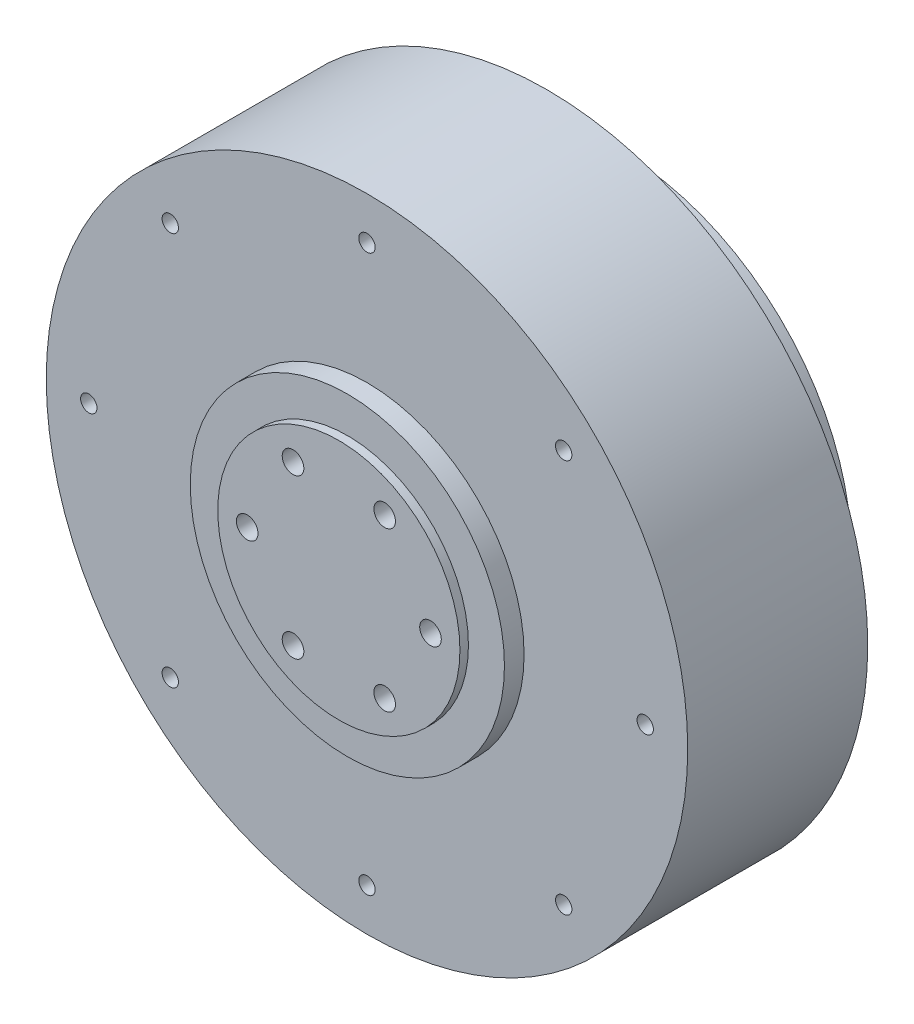
ISO-10303-21;
HEADER;
FILE_DESCRIPTION(('STEP AP214'),'2;1');
FILE_NAME('part.step','',(''),(''),'','','');
FILE_SCHEMA(('AUTOMOTIVE_DESIGN { 1 0 10303 214 1 1 1 1 }'));
ENDSEC;
DATA;
#1=APPLICATION_CONTEXT('core data for automotive mechanical design processes');
#2=APPLICATION_PROTOCOL_DEFINITION('international standard','automotive_design',2000,#1);
#3=PRODUCT_CONTEXT('',#1,'mechanical');
#4=PRODUCT('Part','Part','',(#3));
#5=PRODUCT_RELATED_PRODUCT_CATEGORY('part','',(#4));
#6=PRODUCT_DEFINITION_FORMATION('','',#4);
#7=PRODUCT_DEFINITION_CONTEXT('part definition',#1,'design');
#8=PRODUCT_DEFINITION('design','',#6,#7);
#9=PRODUCT_DEFINITION_SHAPE('','',#8);
#10=(LENGTH_UNIT() NAMED_UNIT(*) SI_UNIT(.MILLI.,.METRE.));
#11=(NAMED_UNIT(*) PLANE_ANGLE_UNIT() SI_UNIT($,.RADIAN.));
#12=(NAMED_UNIT(*) SI_UNIT($,.STERADIAN.) SOLID_ANGLE_UNIT());
#13=UNCERTAINTY_MEASURE_WITH_UNIT(LENGTH_MEASURE(1.E-05),#10,'distance_accuracy_value','');
#14=(GEOMETRIC_REPRESENTATION_CONTEXT(3) GLOBAL_UNCERTAINTY_ASSIGNED_CONTEXT((#13)) GLOBAL_UNIT_ASSIGNED_CONTEXT((#10,
#11,#12)) REPRESENTATION_CONTEXT('',''));
#15=CARTESIAN_POINT('',(0.,0.,0.));
#16=DIRECTION('',(0.,0.,1.));
#17=DIRECTION('',(1.,0.,0.));
#18=AXIS2_PLACEMENT_3D('',#15,#16,#17);
#19=CARTESIAN_POINT('',(0.,0.,0.));
#20=DIRECTION('',(0.,0.,-1.));
#21=DIRECTION('',(-1.,0.,0.));
#22=AXIS2_PLACEMENT_3D('',#19,#20,#21);
#23=PLANE('',#22);
#24=CARTESIAN_POINT('',(-14.,0.,0.));
#25=DIRECTION('',(0.,0.,1.));
#26=DIRECTION('',(1.,0.,0.));
#27=AXIS2_PLACEMENT_3D('',#24,#25,#26);
#28=CIRCLE('',#27,1.64999999999999);
#29=CARTESIAN_POINT('',(-12.35,0.,0.));
#30=VERTEX_POINT('',#29);
#31=EDGE_CURVE('E221',#30,#30,#28,.T.);
#32=ORIENTED_EDGE('',*,*,#31,.F.);
#33=EDGE_LOOP('',(#32));
#34=FACE_BOUND('',#33,.T.);
#35=CARTESIAN_POINT('',(-6.99999999999997,12.1243556529822,0.));
#36=DIRECTION('',(0.,0.,1.));
#37=DIRECTION('',(1.,0.,0.));
#38=AXIS2_PLACEMENT_3D('',#35,#36,#37);
#39=CIRCLE('',#38,1.64999999999999);
#40=CARTESIAN_POINT('',(-5.34999999999998,12.1243556529822,0.));
#41=VERTEX_POINT('',#40);
#42=EDGE_CURVE('E227',#41,#41,#39,.T.);
#43=ORIENTED_EDGE('',*,*,#42,.F.);
#44=EDGE_LOOP('',(#43));
#45=FACE_BOUND('',#44,.T.);
#46=CARTESIAN_POINT('',(14.,0.,0.));
#47=DIRECTION('',(0.,0.,1.));
#48=DIRECTION('',(1.,0.,0.));
#49=AXIS2_PLACEMENT_3D('',#46,#47,#48);
#50=CIRCLE('',#49,1.64999999999999);
#51=CARTESIAN_POINT('',(15.65,0.,0.));
#52=VERTEX_POINT('',#51);
#53=EDGE_CURVE('E239',#52,#52,#50,.T.);
#54=ORIENTED_EDGE('',*,*,#53,.F.);
#55=EDGE_LOOP('',(#54));
#56=FACE_BOUND('',#55,.T.);
#57=CARTESIAN_POINT('',(6.99999999999989,-12.1243556529822,0.));
#58=DIRECTION('',(0.,0.,1.));
#59=DIRECTION('',(1.,0.,0.));
#60=AXIS2_PLACEMENT_3D('',#57,#58,#59);
#61=CIRCLE('',#60,1.64999999999999);
#62=CARTESIAN_POINT('',(8.64999999999988,-12.1243556529822,0.));
#63=VERTEX_POINT('',#62);
#64=EDGE_CURVE('E245',#63,#63,#61,.T.);
#65=ORIENTED_EDGE('',*,*,#64,.F.);
#66=EDGE_LOOP('',(#65));
#67=FACE_BOUND('',#66,.T.);
#68=CARTESIAN_POINT('',(-7.00000000000014,-12.1243556529821,0.));
#69=DIRECTION('',(0.,0.,1.));
#70=DIRECTION('',(1.,0.,0.));
#71=AXIS2_PLACEMENT_3D('',#68,#69,#70);
#72=CIRCLE('',#71,1.64999999999999);
#73=CARTESIAN_POINT('',(-5.35000000000015,-12.1243556529821,0.));
#74=VERTEX_POINT('',#73);
#75=EDGE_CURVE('E251',#74,#74,#72,.T.);
#76=ORIENTED_EDGE('',*,*,#75,.F.);
#77=EDGE_LOOP('',(#76));
#78=FACE_BOUND('',#77,.T.);
#79=CARTESIAN_POINT('',(0.,0.,0.));
#80=DIRECTION('',(0.,0.,1.));
#81=DIRECTION('',(1.,0.,0.));
#82=AXIS2_PLACEMENT_3D('',#79,#80,#81);
#83=CIRCLE('',#82,18.5);
#84=CARTESIAN_POINT('',(18.5,0.,0.));
#85=VERTEX_POINT('',#84);
#86=EDGE_CURVE('E11',#85,#85,#83,.T.);
#87=ORIENTED_EDGE('',*,*,#86,.T.);
#88=EDGE_LOOP('',(#87));
#89=FACE_BOUND('',#88,.T.);
#90=CARTESIAN_POINT('',(7.00000000000006,12.1243556529821,0.));
#91=DIRECTION('',(0.,0.,1.));
#92=DIRECTION('',(1.,0.,0.));
#93=AXIS2_PLACEMENT_3D('',#90,#91,#92);
#94=CIRCLE('',#93,1.64999999999999);
#95=CARTESIAN_POINT('',(8.65000000000005,12.1243556529821,0.));
#96=VERTEX_POINT('',#95);
#97=EDGE_CURVE('E233',#96,#96,#94,.T.);
#98=ORIENTED_EDGE('',*,*,#97,.F.);
#99=EDGE_LOOP('',(#98));
#100=FACE_BOUND('',#99,.T.);
#101=ADVANCED_FACE('F42',(#34,#45,#56,#67,#78,#89,#100),#23,.F.);
#102=CARTESIAN_POINT('',(0.,0.,42.7707487283704));
#103=DIRECTION('',(0.,0.,1.));
#104=DIRECTION('',(1.,0.,0.));
#105=AXIS2_PLACEMENT_3D('',#102,#103,#104);
#106=CYLINDRICAL_SURFACE('',#105,18.5);
#107=ORIENTED_EDGE('',*,*,#86,.F.);
#108=EDGE_LOOP('',(#107));
#109=FACE_BOUND('',#108,.T.);
#110=CARTESIAN_POINT('',(0.,0.,-1.3));
#111=DIRECTION('',(0.,0.,1.));
#112=DIRECTION('',(1.,0.,0.));
#113=AXIS2_PLACEMENT_3D('',#110,#111,#112);
#114=CIRCLE('',#113,18.5);
#115=CARTESIAN_POINT('',(18.5,0.,-1.3));
#116=VERTEX_POINT('',#115);
#117=EDGE_CURVE('E49',#116,#116,#114,.T.);
#118=ORIENTED_EDGE('',*,*,#117,.T.);
#119=EDGE_LOOP('',(#118));
#120=FACE_BOUND('',#119,.T.);
#121=ADVANCED_FACE('F277',(#109,#120),#106,.T.);
#122=CARTESIAN_POINT('',(0.,18.5,-1.3));
#123=DIRECTION('',(0.,0.,-1.));
#124=DIRECTION('',(-1.,0.,0.));
#125=AXIS2_PLACEMENT_3D('',#122,#123,#124);
#126=PLANE('',#125);
#127=ORIENTED_EDGE('',*,*,#117,.F.);
#128=EDGE_LOOP('',(#127));
#129=FACE_BOUND('',#128,.T.);
#130=CARTESIAN_POINT('',(0.,0.,-1.3));
#131=DIRECTION('',(0.,0.,1.));
#132=DIRECTION('',(1.,0.,0.));
#133=AXIS2_PLACEMENT_3D('',#130,#131,#132);
#134=CIRCLE('',#133,24.);
#135=CARTESIAN_POINT('',(24.,0.,-1.3));
#136=VERTEX_POINT('',#135);
#137=EDGE_CURVE('E272',#136,#136,#134,.T.);
#138=ORIENTED_EDGE('',*,*,#137,.T.);
#139=EDGE_LOOP('',(#138));
#140=FACE_BOUND('',#139,.T.);
#141=ADVANCED_FACE('F279',(#129,#140),#126,.F.);
#142=CARTESIAN_POINT('',(0.,0.,42.7707487283704));
#143=DIRECTION('',(0.,0.,1.));
#144=DIRECTION('',(1.,0.,0.));
#145=AXIS2_PLACEMENT_3D('',#142,#143,#144);
#146=CYLINDRICAL_SURFACE('',#145,24.);
#147=ORIENTED_EDGE('',*,*,#137,.F.);
#148=EDGE_LOOP('',(#147));
#149=FACE_BOUND('',#148,.T.);
#150=CARTESIAN_POINT('',(0.,0.,-4.30000000000001));
#151=DIRECTION('',(0.,0.,1.));
#152=DIRECTION('',(1.,0.,0.));
#153=AXIS2_PLACEMENT_3D('',#150,#151,#152);
#154=CIRCLE('',#153,24.);
#155=CARTESIAN_POINT('',(24.,0.,-4.30000000000001));
#156=VERTEX_POINT('',#155);
#157=EDGE_CURVE('E269',#156,#156,#154,.T.);
#158=ORIENTED_EDGE('',*,*,#157,.T.);
#159=EDGE_LOOP('',(#158));
#160=FACE_BOUND('',#159,.T.);
#161=ADVANCED_FACE('F282',(#149,#160),#146,.T.);
#162=CARTESIAN_POINT('',(0.,24.,-4.30000000000001));
#163=DIRECTION('',(0.,0.,-1.));
#164=DIRECTION('',(-1.,0.,0.));
#165=AXIS2_PLACEMENT_3D('',#162,#163,#164);
#166=PLANE('',#165);
#167=CARTESIAN_POINT('',(-42.5,0.,-4.30000000000001));
#168=DIRECTION('',(0.,0.,1.));
#169=DIRECTION('',(1.,0.,0.));
#170=AXIS2_PLACEMENT_3D('',#167,#168,#169);
#171=CIRCLE('',#170,1.25);
#172=CARTESIAN_POINT('',(-41.25,0.,-4.30000000000001));
#173=VERTEX_POINT('',#172);
#174=EDGE_CURVE('E173',#173,#173,#171,.T.);
#175=ORIENTED_EDGE('',*,*,#174,.F.);
#176=EDGE_LOOP('',(#175));
#177=FACE_BOUND('',#176,.T.);
#178=CARTESIAN_POINT('',(-30.0520382004282,30.0520382004283,-4.30000000000001));
#179=DIRECTION('',(0.,0.,1.));
#180=DIRECTION('',(1.,0.,0.));
#181=AXIS2_PLACEMENT_3D('',#178,#179,#180);
#182=CIRCLE('',#181,1.25);
#183=CARTESIAN_POINT('',(-28.8020382004282,30.0520382004283,-4.30000000000001));
#184=VERTEX_POINT('',#183);
#185=EDGE_CURVE('E179',#184,#184,#182,.T.);
#186=ORIENTED_EDGE('',*,*,#185,.F.);
#187=EDGE_LOOP('',(#186));
#188=FACE_BOUND('',#187,.T.);
#189=CARTESIAN_POINT('',(1.48387956900833E-13,42.5,-4.30000000000001));
#190=DIRECTION('',(0.,0.,1.));
#191=DIRECTION('',(1.,0.,0.));
#192=AXIS2_PLACEMENT_3D('',#189,#190,#191);
#193=CIRCLE('',#192,1.25);
#194=CARTESIAN_POINT('',(1.25000000000015,42.5,-4.30000000000001));
#195=VERTEX_POINT('',#194);
#196=EDGE_CURVE('E185',#195,#195,#193,.T.);
#197=ORIENTED_EDGE('',*,*,#196,.F.);
#198=EDGE_LOOP('',(#197));
#199=FACE_BOUND('',#198,.T.);
#200=CARTESIAN_POINT('',(30.0520382004284,30.0520382004281,-4.30000000000001));
#201=DIRECTION('',(0.,0.,1.));
#202=DIRECTION('',(1.,0.,0.));
#203=AXIS2_PLACEMENT_3D('',#200,#201,#202);
#204=CIRCLE('',#203,1.25);
#205=CARTESIAN_POINT('',(31.3020382004284,30.0520382004281,-4.30000000000001));
#206=VERTEX_POINT('',#205);
#207=EDGE_CURVE('E191',#206,#206,#204,.T.);
#208=ORIENTED_EDGE('',*,*,#207,.F.);
#209=EDGE_LOOP('',(#208));
#210=FACE_BOUND('',#209,.T.);
#211=CARTESIAN_POINT('',(42.5,-2.96775913801666E-13,-4.30000000000001));
#212=DIRECTION('',(0.,0.,1.));
#213=DIRECTION('',(1.,0.,0.));
#214=AXIS2_PLACEMENT_3D('',#211,#212,#213);
#215=CIRCLE('',#214,1.25);
#216=CARTESIAN_POINT('',(43.75,-2.96775913801666E-13,-4.30000000000001));
#217=VERTEX_POINT('',#216);
#218=EDGE_CURVE('E197',#217,#217,#215,.T.);
#219=ORIENTED_EDGE('',*,*,#218,.F.);
#220=EDGE_LOOP('',(#219));
#221=FACE_BOUND('',#220,.T.);
#222=CARTESIAN_POINT('',(30.052038200428,-30.0520382004285,-4.30000000000001));
#223=DIRECTION('',(0.,0.,1.));
#224=DIRECTION('',(1.,0.,0.));
#225=AXIS2_PLACEMENT_3D('',#222,#223,#224);
#226=CIRCLE('',#225,1.25);
#227=CARTESIAN_POINT('',(31.302038200428,-30.0520382004285,-4.30000000000001));
#228=VERTEX_POINT('',#227);
#229=EDGE_CURVE('E203',#228,#228,#226,.T.);
#230=ORIENTED_EDGE('',*,*,#229,.F.);
#231=EDGE_LOOP('',(#230));
#232=FACE_BOUND('',#231,.T.);
#233=CARTESIAN_POINT('',(-4.451638707025E-13,-42.5,-4.30000000000001));
#234=DIRECTION('',(0.,0.,1.));
#235=DIRECTION('',(1.,0.,0.));
#236=AXIS2_PLACEMENT_3D('',#233,#234,#235);
#237=CIRCLE('',#236,1.25);
#238=CARTESIAN_POINT('',(1.24999999999955,-42.5,-4.30000000000001));
#239=VERTEX_POINT('',#238);
#240=EDGE_CURVE('E209',#239,#239,#237,.T.);
#241=ORIENTED_EDGE('',*,*,#240,.F.);
#242=EDGE_LOOP('',(#241));
#243=FACE_BOUND('',#242,.T.);
#244=CARTESIAN_POINT('',(-30.0520382004286,-30.0520382004279,-4.30000000000001));
#245=DIRECTION('',(0.,0.,1.));
#246=DIRECTION('',(1.,0.,0.));
#247=AXIS2_PLACEMENT_3D('',#244,#245,#246);
#248=CIRCLE('',#247,1.25);
#249=CARTESIAN_POINT('',(-28.8020382004286,-30.0520382004279,-4.30000000000001));
#250=VERTEX_POINT('',#249);
#251=EDGE_CURVE('E215',#250,#250,#248,.T.);
#252=ORIENTED_EDGE('',*,*,#251,.F.);
#253=EDGE_LOOP('',(#252));
#254=FACE_BOUND('',#253,.T.);
#255=ORIENTED_EDGE('',*,*,#157,.F.);
#256=EDGE_LOOP('',(#255));
#257=FACE_BOUND('',#256,.T.);
#258=CARTESIAN_POINT('',(0.,0.,-4.30000000000001));
#259=DIRECTION('',(0.,0.,1.));
#260=DIRECTION('',(1.,0.,0.));
#261=AXIS2_PLACEMENT_3D('',#258,#259,#260);
#262=CIRCLE('',#261,49.);
#263=CARTESIAN_POINT('',(49.,0.,-4.30000000000001));
#264=VERTEX_POINT('',#263);
#265=EDGE_CURVE('E266',#264,#264,#262,.T.);
#266=ORIENTED_EDGE('',*,*,#265,.T.);
#267=EDGE_LOOP('',(#266));
#268=FACE_BOUND('',#267,.T.);
#269=ADVANCED_FACE('F288',(#177,#188,#199,#210,#221,#232,#243,#254,#257,#268),#166,.F.);
#270=CARTESIAN_POINT('',(0.,0.,42.7707487283704));
#271=DIRECTION('',(0.,0.,1.));
#272=DIRECTION('',(1.,0.,0.));
#273=AXIS2_PLACEMENT_3D('',#270,#271,#272);
#274=CYLINDRICAL_SURFACE('',#273,49.);
#275=ORIENTED_EDGE('',*,*,#265,.F.);
#276=EDGE_LOOP('',(#275));
#277=FACE_BOUND('',#276,.T.);
#278=CARTESIAN_POINT('',(0.,0.,-31.8));
#279=DIRECTION('',(0.,0.,1.));
#280=DIRECTION('',(1.,0.,0.));
#281=AXIS2_PLACEMENT_3D('',#278,#279,#280);
#282=CIRCLE('',#281,49.);
#283=CARTESIAN_POINT('',(49.,0.,-31.8));
#284=VERTEX_POINT('',#283);
#285=EDGE_CURVE('E263',#284,#284,#282,.T.);
#286=ORIENTED_EDGE('',*,*,#285,.T.);
#287=EDGE_LOOP('',(#286));
#288=FACE_BOUND('',#287,.T.);
#289=ADVANCED_FACE('F294',(#277,#288),#274,.T.);
#290=CARTESIAN_POINT('',(0.,49.,-31.8));
#291=DIRECTION('',(0.,0.,1.));
#292=DIRECTION('',(1.,0.,0.));
#293=AXIS2_PLACEMENT_3D('',#290,#291,#292);
#294=PLANE('',#293);
#295=CARTESIAN_POINT('',(42.5,0.,-31.8));
#296=DIRECTION('',(0.,0.,-1.));
#297=DIRECTION('',(-1.,0.,0.));
#298=AXIS2_PLACEMENT_3D('',#295,#296,#297);
#299=CIRCLE('',#298,1.24999999999999);
#300=CARTESIAN_POINT('',(41.25,0.,-31.8));
#301=VERTEX_POINT('',#300);
#302=EDGE_CURVE('E127',#301,#301,#299,.T.);
#303=ORIENTED_EDGE('',*,*,#302,.F.);
#304=EDGE_LOOP('',(#303));
#305=FACE_BOUND('',#304,.T.);
#306=CARTESIAN_POINT('',(30.0520382004282,30.0520382004283,-31.8));
#307=DIRECTION('',(0.,0.,-1.));
#308=DIRECTION('',(-1.,0.,0.));
#309=AXIS2_PLACEMENT_3D('',#306,#307,#308);
#310=CIRCLE('',#309,1.24999999999999);
#311=CARTESIAN_POINT('',(28.8020382004282,30.0520382004283,-31.8));
#312=VERTEX_POINT('',#311);
#313=EDGE_CURVE('E126',#312,#312,#310,.T.);
#314=ORIENTED_EDGE('',*,*,#313,.F.);
#315=EDGE_LOOP('',(#314));
#316=FACE_BOUND('',#315,.T.);
#317=CARTESIAN_POINT('',(-1.48387956900833E-13,42.5,-31.8));
#318=DIRECTION('',(0.,0.,-1.));
#319=DIRECTION('',(-1.,0.,0.));
#320=AXIS2_PLACEMENT_3D('',#317,#318,#319);
#321=CIRCLE('',#320,1.24999999999999);
#322=CARTESIAN_POINT('',(-1.25000000000014,42.5,-31.8));
#323=VERTEX_POINT('',#322);
#324=EDGE_CURVE('E137',#323,#323,#321,.T.);
#325=ORIENTED_EDGE('',*,*,#324,.F.);
#326=EDGE_LOOP('',(#325));
#327=FACE_BOUND('',#326,.T.);
#328=CARTESIAN_POINT('',(-30.0520382004284,30.0520382004281,-31.8));
#329=DIRECTION('',(0.,0.,-1.));
#330=DIRECTION('',(-1.,0.,0.));
#331=AXIS2_PLACEMENT_3D('',#328,#329,#330);
#332=CIRCLE('',#331,1.24999999999999);
#333=CARTESIAN_POINT('',(-31.3020382004284,30.0520382004281,-31.8));
#334=VERTEX_POINT('',#333);
#335=EDGE_CURVE('E143',#334,#334,#332,.T.);
#336=ORIENTED_EDGE('',*,*,#335,.F.);
#337=EDGE_LOOP('',(#336));
#338=FACE_BOUND('',#337,.T.);
#339=CARTESIAN_POINT('',(-42.5,-2.96775913801666E-13,-31.8));
#340=DIRECTION('',(0.,0.,-1.));
#341=DIRECTION('',(-1.,0.,0.));
#342=AXIS2_PLACEMENT_3D('',#339,#340,#341);
#343=CIRCLE('',#342,1.24999999999999);
#344=CARTESIAN_POINT('',(-43.75,-2.96775913801666E-13,-31.8));
#345=VERTEX_POINT('',#344);
#346=EDGE_CURVE('E149',#345,#345,#343,.T.);
#347=ORIENTED_EDGE('',*,*,#346,.F.);
#348=EDGE_LOOP('',(#347));
#349=FACE_BOUND('',#348,.T.);
#350=CARTESIAN_POINT('',(-30.052038200428,-30.0520382004285,-31.8));
#351=DIRECTION('',(0.,0.,-1.));
#352=DIRECTION('',(-1.,0.,0.));
#353=AXIS2_PLACEMENT_3D('',#350,#351,#352);
#354=CIRCLE('',#353,1.24999999999999);
#355=CARTESIAN_POINT('',(-31.302038200428,-30.0520382004285,-31.8));
#356=VERTEX_POINT('',#355);
#357=EDGE_CURVE('E155',#356,#356,#354,.T.);
#358=ORIENTED_EDGE('',*,*,#357,.F.);
#359=EDGE_LOOP('',(#358));
#360=FACE_BOUND('',#359,.T.);
#361=CARTESIAN_POINT('',(4.451638707025E-13,-42.5,-31.8));
#362=DIRECTION('',(0.,0.,-1.));
#363=DIRECTION('',(-1.,0.,0.));
#364=AXIS2_PLACEMENT_3D('',#361,#362,#363);
#365=CIRCLE('',#364,1.24999999999999);
#366=CARTESIAN_POINT('',(-1.24999999999954,-42.5,-31.8));
#367=VERTEX_POINT('',#366);
#368=EDGE_CURVE('E161',#367,#367,#365,.T.);
#369=ORIENTED_EDGE('',*,*,#368,.F.);
#370=EDGE_LOOP('',(#369));
#371=FACE_BOUND('',#370,.T.);
#372=CARTESIAN_POINT('',(30.0520382004286,-30.0520382004279,-31.8));
#373=DIRECTION('',(0.,0.,-1.));
#374=DIRECTION('',(-1.,0.,0.));
#375=AXIS2_PLACEMENT_3D('',#372,#373,#374);
#376=CIRCLE('',#375,1.24999999999999);
#377=CARTESIAN_POINT('',(28.8020382004287,-30.0520382004279,-31.8));
#378=VERTEX_POINT('',#377);
#379=EDGE_CURVE('E167',#378,#378,#376,.T.);
#380=ORIENTED_EDGE('',*,*,#379,.F.);
#381=EDGE_LOOP('',(#380));
#382=FACE_BOUND('',#381,.T.);
#383=ORIENTED_EDGE('',*,*,#285,.F.);
#384=EDGE_LOOP('',(#383));
#385=FACE_BOUND('',#384,.T.);
#386=CARTESIAN_POINT('',(0.,0.,-31.8));
#387=DIRECTION('',(0.,0.,1.));
#388=DIRECTION('',(1.,0.,0.));
#389=AXIS2_PLACEMENT_3D('',#386,#387,#388);
#390=CIRCLE('',#389,35.5);
#391=CARTESIAN_POINT('',(35.5,0.,-31.8));
#392=VERTEX_POINT('',#391);
#393=EDGE_CURVE('E260',#392,#392,#390,.T.);
#394=ORIENTED_EDGE('',*,*,#393,.T.);
#395=EDGE_LOOP('',(#394));
#396=FACE_BOUND('',#395,.T.);
#397=ADVANCED_FACE('F301',(#305,#316,#327,#338,#349,#360,#371,#382,#385,#396),#294,.F.);
#398=CARTESIAN_POINT('',(0.,0.,42.7707487283704));
#399=DIRECTION('',(0.,0.,1.));
#400=DIRECTION('',(1.,0.,0.));
#401=AXIS2_PLACEMENT_3D('',#398,#399,#400);
#402=CYLINDRICAL_SURFACE('',#401,35.5);
#403=ORIENTED_EDGE('',*,*,#393,.F.);
#404=EDGE_LOOP('',(#403));
#405=FACE_BOUND('',#404,.T.);
#406=CARTESIAN_POINT('',(0.,0.,-42.8));
#407=DIRECTION('',(0.,0.,1.));
#408=DIRECTION('',(1.,0.,0.));
#409=AXIS2_PLACEMENT_3D('',#406,#407,#408);
#410=CIRCLE('',#409,35.5);
#411=CARTESIAN_POINT('',(35.5,0.,-42.8));
#412=VERTEX_POINT('',#411);
#413=EDGE_CURVE('E257',#412,#412,#410,.T.);
#414=ORIENTED_EDGE('',*,*,#413,.T.);
#415=EDGE_LOOP('',(#414));
#416=FACE_BOUND('',#415,.T.);
#417=ADVANCED_FACE('F307',(#405,#416),#402,.T.);
#418=CARTESIAN_POINT('',(0.,35.5,-42.8));
#419=DIRECTION('',(0.,0.,1.));
#420=DIRECTION('',(1.,0.,0.));
#421=AXIS2_PLACEMENT_3D('',#418,#419,#420);
#422=PLANE('',#421);
#423=ORIENTED_EDGE('',*,*,#413,.F.);
#424=EDGE_LOOP('',(#423));
#425=FACE_BOUND('',#424,.T.);
#426=ADVANCED_FACE('F314',(#425),#422,.F.);
#427=CARTESIAN_POINT('',(-7.00000000000014,-12.1243556529821,-5.));
#428=DIRECTION('',(0.,0.,1.));
#429=DIRECTION('',(1.,0.,0.));
#430=AXIS2_PLACEMENT_3D('',#427,#428,#429);
#431=CONICAL_SURFACE('',#430,1.64999999999999,1.02974425867665);
#432=CARTESIAN_POINT('',(-7.00000000000014,-12.1243556529821,-5.99142002139547));
#433=VERTEX_POINT('',#432);
#434=VERTEX_LOOP('',#433);
#435=FACE_BOUND('',#434,.T.);
#436=CARTESIAN_POINT('',(-7.00000000000014,-12.1243556529821,-5.));
#437=DIRECTION('',(0.,0.,1.));
#438=DIRECTION('',(1.,0.,0.));
#439=AXIS2_PLACEMENT_3D('',#436,#437,#438);
#440=CIRCLE('',#439,1.64999999999999);
#441=CARTESIAN_POINT('',(-5.35000000000015,-12.1243556529821,-5.));
#442=VERTEX_POINT('',#441);
#443=EDGE_CURVE('E254',#442,#442,#440,.T.);
#444=ORIENTED_EDGE('',*,*,#443,.T.);
#445=EDGE_LOOP('',(#444));
#446=FACE_BOUND('',#445,.T.);
#447=ADVANCED_FACE('F319',(#435,#446),#431,.F.);
#448=CARTESIAN_POINT('',(-7.00000000000014,-12.1243556529821,0.));
#449=DIRECTION('',(0.,0.,1.));
#450=DIRECTION('',(1.,0.,0.));
#451=AXIS2_PLACEMENT_3D('',#448,#449,#450);
#452=CYLINDRICAL_SURFACE('',#451,1.64999999999999);
#453=ORIENTED_EDGE('',*,*,#443,.F.);
#454=EDGE_LOOP('',(#453));
#455=FACE_BOUND('',#454,.T.);
#456=ORIENTED_EDGE('',*,*,#75,.T.);
#457=EDGE_LOOP('',(#456));
#458=FACE_BOUND('',#457,.T.);
#459=ADVANCED_FACE('F324',(#455,#458),#452,.F.);
#460=CARTESIAN_POINT('',(6.99999999999989,-12.1243556529822,-5.));
#461=DIRECTION('',(0.,0.,1.));
#462=DIRECTION('',(1.,0.,0.));
#463=AXIS2_PLACEMENT_3D('',#460,#461,#462);
#464=CONICAL_SURFACE('',#463,1.64999999999999,1.02974425867665);
#465=CARTESIAN_POINT('',(6.99999999999988,-12.1243556529822,-5.99142002139547));
#466=VERTEX_POINT('',#465);
#467=VERTEX_LOOP('',#466);
#468=FACE_BOUND('',#467,.T.);
#469=CARTESIAN_POINT('',(6.99999999999989,-12.1243556529822,-5.));
#470=DIRECTION('',(0.,0.,1.));
#471=DIRECTION('',(1.,0.,0.));
#472=AXIS2_PLACEMENT_3D('',#469,#470,#471);
#473=CIRCLE('',#472,1.64999999999999);
#474=CARTESIAN_POINT('',(8.64999999999987,-12.1243556529822,-5.));
#475=VERTEX_POINT('',#474);
#476=EDGE_CURVE('E248',#475,#475,#473,.T.);
#477=ORIENTED_EDGE('',*,*,#476,.T.);
#478=EDGE_LOOP('',(#477));
#479=FACE_BOUND('',#478,.T.);
#480=ADVANCED_FACE('F375',(#468,#479),#464,.F.);
#481=CARTESIAN_POINT('',(6.99999999999989,-12.1243556529822,0.));
#482=DIRECTION('',(0.,0.,1.));
#483=DIRECTION('',(1.,0.,0.));
#484=AXIS2_PLACEMENT_3D('',#481,#482,#483);
#485=CYLINDRICAL_SURFACE('',#484,1.64999999999999);
#486=ORIENTED_EDGE('',*,*,#476,.F.);
#487=EDGE_LOOP('',(#486));
#488=FACE_BOUND('',#487,.T.);
#489=ORIENTED_EDGE('',*,*,#64,.T.);
#490=EDGE_LOOP('',(#489));
#491=FACE_BOUND('',#490,.T.);
#492=ADVANCED_FACE('F371',(#488,#491),#485,.F.);
#493=CARTESIAN_POINT('',(14.,0.,-5.));
#494=DIRECTION('',(0.,0.,1.));
#495=DIRECTION('',(1.,0.,0.));
#496=AXIS2_PLACEMENT_3D('',#493,#494,#495);
#497=CONICAL_SURFACE('',#496,1.64999999999999,1.02974425867665);
#498=CARTESIAN_POINT('',(14.,0.,-5.99142002139547));
#499=VERTEX_POINT('',#498);
#500=VERTEX_LOOP('',#499);
#501=FACE_BOUND('',#500,.T.);
#502=CARTESIAN_POINT('',(14.,0.,-5.));
#503=DIRECTION('',(0.,0.,1.));
#504=DIRECTION('',(1.,0.,0.));
#505=AXIS2_PLACEMENT_3D('',#502,#503,#504);
#506=CIRCLE('',#505,1.64999999999999);
#507=CARTESIAN_POINT('',(15.65,0.,-5.));
#508=VERTEX_POINT('',#507);
#509=EDGE_CURVE('E242',#508,#508,#506,.T.);
#510=ORIENTED_EDGE('',*,*,#509,.T.);
#511=EDGE_LOOP('',(#510));
#512=FACE_BOUND('',#511,.T.);
#513=ADVANCED_FACE('F367',(#501,#512),#497,.F.);
#514=CARTESIAN_POINT('',(14.,0.,0.));
#515=DIRECTION('',(0.,0.,1.));
#516=DIRECTION('',(1.,0.,0.));
#517=AXIS2_PLACEMENT_3D('',#514,#515,#516);
#518=CYLINDRICAL_SURFACE('',#517,1.64999999999999);
#519=ORIENTED_EDGE('',*,*,#509,.F.);
#520=EDGE_LOOP('',(#519));
#521=FACE_BOUND('',#520,.T.);
#522=ORIENTED_EDGE('',*,*,#53,.T.);
#523=EDGE_LOOP('',(#522));
#524=FACE_BOUND('',#523,.T.);
#525=ADVANCED_FACE('F359',(#521,#524),#518,.F.);
#526=CARTESIAN_POINT('',(7.00000000000006,12.1243556529821,-5.));
#527=DIRECTION('',(0.,0.,1.));
#528=DIRECTION('',(1.,0.,0.));
#529=AXIS2_PLACEMENT_3D('',#526,#527,#528);
#530=CONICAL_SURFACE('',#529,1.64999999999999,1.02974425867665);
#531=CARTESIAN_POINT('',(7.00000000000006,12.1243556529821,-5.99142002139547));
#532=VERTEX_POINT('',#531);
#533=VERTEX_LOOP('',#532);
#534=FACE_BOUND('',#533,.T.);
#535=CARTESIAN_POINT('',(7.00000000000006,12.1243556529821,-5.));
#536=DIRECTION('',(0.,0.,1.));
#537=DIRECTION('',(1.,0.,0.));
#538=AXIS2_PLACEMENT_3D('',#535,#536,#537);
#539=CIRCLE('',#538,1.64999999999999);
#540=CARTESIAN_POINT('',(8.65000000000004,12.1243556529821,-5.));
#541=VERTEX_POINT('',#540);
#542=EDGE_CURVE('E236',#541,#541,#539,.T.);
#543=ORIENTED_EDGE('',*,*,#542,.T.);
#544=EDGE_LOOP('',(#543));
#545=FACE_BOUND('',#544,.T.);
#546=ADVANCED_FACE('F349',(#534,#545),#530,.F.);
#547=CARTESIAN_POINT('',(7.00000000000006,12.1243556529821,0.));
#548=DIRECTION('',(0.,0.,1.));
#549=DIRECTION('',(1.,0.,0.));
#550=AXIS2_PLACEMENT_3D('',#547,#548,#549);
#551=CYLINDRICAL_SURFACE('',#550,1.64999999999999);
#552=ORIENTED_EDGE('',*,*,#542,.F.);
#553=EDGE_LOOP('',(#552));
#554=FACE_BOUND('',#553,.T.);
#555=ORIENTED_EDGE('',*,*,#97,.T.);
#556=EDGE_LOOP('',(#555));
#557=FACE_BOUND('',#556,.T.);
#558=ADVANCED_FACE('F346',(#554,#557),#551,.F.);
#559=CARTESIAN_POINT('',(-6.99999999999997,12.1243556529822,-5.));
#560=DIRECTION('',(0.,0.,1.));
#561=DIRECTION('',(1.,0.,0.));
#562=AXIS2_PLACEMENT_3D('',#559,#560,#561);
#563=CONICAL_SURFACE('',#562,1.64999999999999,1.02974425867665);
#564=CARTESIAN_POINT('',(-6.99999999999998,12.1243556529822,-5.99142002139547));
#565=VERTEX_POINT('',#564);
#566=VERTEX_LOOP('',#565);
#567=FACE_BOUND('',#566,.T.);
#568=CARTESIAN_POINT('',(-6.99999999999997,12.1243556529822,-5.));
#569=DIRECTION('',(0.,0.,1.));
#570=DIRECTION('',(1.,0.,0.));
#571=AXIS2_PLACEMENT_3D('',#568,#569,#570);
#572=CIRCLE('',#571,1.64999999999999);
#573=CARTESIAN_POINT('',(-5.34999999999999,12.1243556529822,-5.));
#574=VERTEX_POINT('',#573);
#575=EDGE_CURVE('E230',#574,#574,#572,.T.);
#576=ORIENTED_EDGE('',*,*,#575,.T.);
#577=EDGE_LOOP('',(#576));
#578=FACE_BOUND('',#577,.T.);
#579=ADVANCED_FACE('F348',(#567,#578),#563,.F.);
#580=CARTESIAN_POINT('',(-6.99999999999997,12.1243556529822,0.));
#581=DIRECTION('',(0.,0.,1.));
#582=DIRECTION('',(1.,0.,0.));
#583=AXIS2_PLACEMENT_3D('',#580,#581,#582);
#584=CYLINDRICAL_SURFACE('',#583,1.64999999999999);
#585=ORIENTED_EDGE('',*,*,#575,.F.);
#586=EDGE_LOOP('',(#585));
#587=FACE_BOUND('',#586,.T.);
#588=ORIENTED_EDGE('',*,*,#42,.T.);
#589=EDGE_LOOP('',(#588));
#590=FACE_BOUND('',#589,.T.);
#591=ADVANCED_FACE('F356',(#587,#590),#584,.F.);
#592=CARTESIAN_POINT('',(-14.,0.,-5.));
#593=DIRECTION('',(0.,0.,1.));
#594=DIRECTION('',(1.,0.,0.));
#595=AXIS2_PLACEMENT_3D('',#592,#593,#594);
#596=CONICAL_SURFACE('',#595,1.64999999999999,1.02974425867665);
#597=CARTESIAN_POINT('',(-14.,0.,-5.99142002139547));
#598=VERTEX_POINT('',#597);
#599=VERTEX_LOOP('',#598);
#600=FACE_BOUND('',#599,.T.);
#601=CARTESIAN_POINT('',(-14.,0.,-5.));
#602=DIRECTION('',(0.,0.,1.));
#603=DIRECTION('',(1.,0.,0.));
#604=AXIS2_PLACEMENT_3D('',#601,#602,#603);
#605=CIRCLE('',#604,1.64999999999999);
#606=CARTESIAN_POINT('',(-12.35,0.,-5.));
#607=VERTEX_POINT('',#606);
#608=EDGE_CURVE('E224',#607,#607,#605,.T.);
#609=ORIENTED_EDGE('',*,*,#608,.T.);
#610=EDGE_LOOP('',(#609));
#611=FACE_BOUND('',#610,.T.);
#612=ADVANCED_FACE('F438',(#600,#611),#596,.F.);
#613=CARTESIAN_POINT('',(-14.,0.,0.));
#614=DIRECTION('',(0.,0.,1.));
#615=DIRECTION('',(1.,0.,0.));
#616=AXIS2_PLACEMENT_3D('',#613,#614,#615);
#617=CYLINDRICAL_SURFACE('',#616,1.64999999999999);
#618=ORIENTED_EDGE('',*,*,#608,.F.);
#619=EDGE_LOOP('',(#618));
#620=FACE_BOUND('',#619,.T.);
#621=ORIENTED_EDGE('',*,*,#31,.T.);
#622=EDGE_LOOP('',(#621));
#623=FACE_BOUND('',#622,.T.);
#624=ADVANCED_FACE('F449',(#620,#623),#617,.F.);
#625=CARTESIAN_POINT('',(-30.0520382004286,-30.0520382004279,-7.30000000000001));
#626=DIRECTION('',(0.,0.,1.));
#627=DIRECTION('',(1.,0.,0.));
#628=AXIS2_PLACEMENT_3D('',#625,#626,#627);
#629=CONICAL_SURFACE('',#628,1.25,1.02974425867665);
#630=CARTESIAN_POINT('',(-30.0520382004286,-30.0520382004279,-8.05107577378446));
#631=VERTEX_POINT('',#630);
#632=VERTEX_LOOP('',#631);
#633=FACE_BOUND('',#632,.T.);
#634=CARTESIAN_POINT('',(-30.0520382004286,-30.0520382004279,-7.30000000000001));
#635=DIRECTION('',(0.,0.,1.));
#636=DIRECTION('',(1.,0.,0.));
#637=AXIS2_PLACEMENT_3D('',#634,#635,#636);
#638=CIRCLE('',#637,1.25);
#639=CARTESIAN_POINT('',(-28.8020382004286,-30.0520382004279,-7.30000000000001));
#640=VERTEX_POINT('',#639);
#641=EDGE_CURVE('E218',#640,#640,#638,.T.);
#642=ORIENTED_EDGE('',*,*,#641,.T.);
#643=EDGE_LOOP('',(#642));
#644=FACE_BOUND('',#643,.T.);
#645=ADVANCED_FACE('F459',(#633,#644),#629,.F.);
#646=CARTESIAN_POINT('',(-30.0520382004286,-30.0520382004279,-4.30000000000001));
#647=DIRECTION('',(0.,0.,1.));
#648=DIRECTION('',(1.,0.,0.));
#649=AXIS2_PLACEMENT_3D('',#646,#647,#648);
#650=CYLINDRICAL_SURFACE('',#649,1.25);
#651=ORIENTED_EDGE('',*,*,#641,.F.);
#652=EDGE_LOOP('',(#651));
#653=FACE_BOUND('',#652,.T.);
#654=ORIENTED_EDGE('',*,*,#251,.T.);
#655=EDGE_LOOP('',(#654));
#656=FACE_BOUND('',#655,.T.);
#657=ADVANCED_FACE('F482',(#653,#656),#650,.F.);
#658=CARTESIAN_POINT('',(-4.451638707025E-13,-42.5,-7.30000000000001));
#659=DIRECTION('',(0.,0.,1.));
#660=DIRECTION('',(1.,0.,0.));
#661=AXIS2_PLACEMENT_3D('',#658,#659,#660);
#662=CONICAL_SURFACE('',#661,1.25,1.02974425867665);
#663=CARTESIAN_POINT('',(-4.46082619290444E-13,-42.5,-8.05107577378446));
#664=VERTEX_POINT('',#663);
#665=VERTEX_LOOP('',#664);
#666=FACE_BOUND('',#665,.T.);
#667=CARTESIAN_POINT('',(-4.451638707025E-13,-42.5,-7.30000000000001));
#668=DIRECTION('',(0.,0.,1.));
#669=DIRECTION('',(1.,0.,0.));
#670=AXIS2_PLACEMENT_3D('',#667,#668,#669);
#671=CIRCLE('',#670,1.25);
#672=CARTESIAN_POINT('',(1.24999999999955,-42.5,-7.30000000000001));
#673=VERTEX_POINT('',#672);
#674=EDGE_CURVE('E212',#673,#673,#671,.T.);
#675=ORIENTED_EDGE('',*,*,#674,.T.);
#676=EDGE_LOOP('',(#675));
#677=FACE_BOUND('',#676,.T.);
#678=ADVANCED_FACE('F492',(#666,#677),#662,.F.);
#679=CARTESIAN_POINT('',(-4.451638707025E-13,-42.5,-4.30000000000001));
#680=DIRECTION('',(0.,0.,1.));
#681=DIRECTION('',(1.,0.,0.));
#682=AXIS2_PLACEMENT_3D('',#679,#680,#681);
#683=CYLINDRICAL_SURFACE('',#682,1.25);
#684=ORIENTED_EDGE('',*,*,#674,.F.);
#685=EDGE_LOOP('',(#684));
#686=FACE_BOUND('',#685,.T.);
#687=ORIENTED_EDGE('',*,*,#240,.T.);
#688=EDGE_LOOP('',(#687));
#689=FACE_BOUND('',#688,.T.);
#690=ADVANCED_FACE('F503',(#686,#689),#683,.F.);
#691=CARTESIAN_POINT('',(30.052038200428,-30.0520382004285,-7.30000000000001));
#692=DIRECTION('',(0.,0.,1.));
#693=DIRECTION('',(1.,0.,0.));
#694=AXIS2_PLACEMENT_3D('',#691,#692,#693);
#695=CONICAL_SURFACE('',#694,1.25,1.02974425867665);
#696=CARTESIAN_POINT('',(30.052038200428,-30.0520382004285,-8.05107577378446));
#697=VERTEX_POINT('',#696);
#698=VERTEX_LOOP('',#697);
#699=FACE_BOUND('',#698,.T.);
#700=CARTESIAN_POINT('',(30.052038200428,-30.0520382004285,-7.30000000000001));
#701=DIRECTION('',(0.,0.,1.));
#702=DIRECTION('',(1.,0.,0.));
#703=AXIS2_PLACEMENT_3D('',#700,#701,#702);
#704=CIRCLE('',#703,1.25);
#705=CARTESIAN_POINT('',(31.302038200428,-30.0520382004285,-7.30000000000001));
#706=VERTEX_POINT('',#705);
#707=EDGE_CURVE('E206',#706,#706,#704,.T.);
#708=ORIENTED_EDGE('',*,*,#707,.T.);
#709=EDGE_LOOP('',(#708));
#710=FACE_BOUND('',#709,.T.);
#711=ADVANCED_FACE('F513',(#699,#710),#695,.F.);
#712=CARTESIAN_POINT('',(30.052038200428,-30.0520382004285,-4.30000000000001));
#713=DIRECTION('',(0.,0.,1.));
#714=DIRECTION('',(1.,0.,0.));
#715=AXIS2_PLACEMENT_3D('',#712,#713,#714);
#716=CYLINDRICAL_SURFACE('',#715,1.25);
#717=ORIENTED_EDGE('',*,*,#707,.F.);
#718=EDGE_LOOP('',(#717));
#719=FACE_BOUND('',#718,.T.);
#720=ORIENTED_EDGE('',*,*,#229,.T.);
#721=EDGE_LOOP('',(#720));
#722=FACE_BOUND('',#721,.T.);
#723=ADVANCED_FACE('F525',(#719,#722),#716,.F.);
#724=CARTESIAN_POINT('',(42.5,-2.96775913801666E-13,-7.30000000000001));
#725=DIRECTION('',(0.,0.,1.));
#726=DIRECTION('',(1.,0.,0.));
#727=AXIS2_PLACEMENT_3D('',#724,#725,#726);
#728=CONICAL_SURFACE('',#727,1.25,1.02974425867665);
#729=CARTESIAN_POINT('',(42.5,-2.96775913801666E-13,-8.05107577378446));
#730=VERTEX_POINT('',#729);
#731=VERTEX_LOOP('',#730);
#732=FACE_BOUND('',#731,.T.);
#733=CARTESIAN_POINT('',(42.5,-2.96775913801666E-13,-7.30000000000001));
#734=DIRECTION('',(0.,0.,1.));
#735=DIRECTION('',(1.,0.,0.));
#736=AXIS2_PLACEMENT_3D('',#733,#734,#735);
#737=CIRCLE('',#736,1.25);
#738=CARTESIAN_POINT('',(43.75,-2.96775913801666E-13,-7.30000000000001));
#739=VERTEX_POINT('',#738);
#740=EDGE_CURVE('E200',#739,#739,#737,.T.);
#741=ORIENTED_EDGE('',*,*,#740,.T.);
#742=EDGE_LOOP('',(#741));
#743=FACE_BOUND('',#742,.T.);
#744=ADVANCED_FACE('F535',(#732,#743),#728,.F.);
#745=CARTESIAN_POINT('',(42.5,-2.96775913801666E-13,-4.30000000000001));
#746=DIRECTION('',(0.,0.,1.));
#747=DIRECTION('',(1.,0.,0.));
#748=AXIS2_PLACEMENT_3D('',#745,#746,#747);
#749=CYLINDRICAL_SURFACE('',#748,1.25);
#750=ORIENTED_EDGE('',*,*,#740,.F.);
#751=EDGE_LOOP('',(#750));
#752=FACE_BOUND('',#751,.T.);
#753=ORIENTED_EDGE('',*,*,#218,.T.);
#754=EDGE_LOOP('',(#753));
#755=FACE_BOUND('',#754,.T.);
#756=ADVANCED_FACE('F547',(#752,#755),#749,.F.);
#757=CARTESIAN_POINT('',(30.0520382004284,30.0520382004281,-7.30000000000001));
#758=DIRECTION('',(0.,0.,1.));
#759=DIRECTION('',(1.,0.,0.));
#760=AXIS2_PLACEMENT_3D('',#757,#758,#759);
#761=CONICAL_SURFACE('',#760,1.25,1.02974425867665);
#762=CARTESIAN_POINT('',(30.0520382004284,30.0520382004281,-8.05107577378446));
#763=VERTEX_POINT('',#762);
#764=VERTEX_LOOP('',#763);
#765=FACE_BOUND('',#764,.T.);
#766=CARTESIAN_POINT('',(30.0520382004284,30.0520382004281,-7.30000000000001));
#767=DIRECTION('',(0.,0.,1.));
#768=DIRECTION('',(1.,0.,0.));
#769=AXIS2_PLACEMENT_3D('',#766,#767,#768);
#770=CIRCLE('',#769,1.25);
#771=CARTESIAN_POINT('',(31.3020382004284,30.0520382004281,-7.30000000000001));
#772=VERTEX_POINT('',#771);
#773=EDGE_CURVE('E194',#772,#772,#770,.T.);
#774=ORIENTED_EDGE('',*,*,#773,.T.);
#775=EDGE_LOOP('',(#774));
#776=FACE_BOUND('',#775,.T.);
#777=ADVANCED_FACE('F557',(#765,#776),#761,.F.);
#778=CARTESIAN_POINT('',(30.0520382004284,30.0520382004281,-4.30000000000001));
#779=DIRECTION('',(0.,0.,1.));
#780=DIRECTION('',(1.,0.,0.));
#781=AXIS2_PLACEMENT_3D('',#778,#779,#780);
#782=CYLINDRICAL_SURFACE('',#781,1.25);
#783=ORIENTED_EDGE('',*,*,#773,.F.);
#784=EDGE_LOOP('',(#783));
#785=FACE_BOUND('',#784,.T.);
#786=ORIENTED_EDGE('',*,*,#207,.T.);
#787=EDGE_LOOP('',(#786));
#788=FACE_BOUND('',#787,.T.);
#789=ADVANCED_FACE('F569',(#785,#788),#782,.F.);
#790=CARTESIAN_POINT('',(1.48387956900833E-13,42.5,-7.30000000000001));
#791=DIRECTION('',(0.,0.,1.));
#792=DIRECTION('',(1.,0.,0.));
#793=AXIS2_PLACEMENT_3D('',#790,#791,#792);
#794=CONICAL_SURFACE('',#793,1.25,1.02974425867665);
#795=CARTESIAN_POINT('',(1.47469208312888E-13,42.5,-8.05107577378446));
#796=VERTEX_POINT('',#795);
#797=VERTEX_LOOP('',#796);
#798=FACE_BOUND('',#797,.T.);
#799=CARTESIAN_POINT('',(1.48387956900833E-13,42.5,-7.30000000000001));
#800=DIRECTION('',(0.,0.,1.));
#801=DIRECTION('',(1.,0.,0.));
#802=AXIS2_PLACEMENT_3D('',#799,#800,#801);
#803=CIRCLE('',#802,1.25);
#804=CARTESIAN_POINT('',(1.25000000000015,42.5,-7.30000000000001));
#805=VERTEX_POINT('',#804);
#806=EDGE_CURVE('E188',#805,#805,#803,.T.);
#807=ORIENTED_EDGE('',*,*,#806,.T.);
#808=EDGE_LOOP('',(#807));
#809=FACE_BOUND('',#808,.T.);
#810=ADVANCED_FACE('F579',(#798,#809),#794,.F.);
#811=CARTESIAN_POINT('',(1.48387956900833E-13,42.5,-4.30000000000001));
#812=DIRECTION('',(0.,0.,1.));
#813=DIRECTION('',(1.,0.,0.));
#814=AXIS2_PLACEMENT_3D('',#811,#812,#813);
#815=CYLINDRICAL_SURFACE('',#814,1.25);
#816=ORIENTED_EDGE('',*,*,#806,.F.);
#817=EDGE_LOOP('',(#816));
#818=FACE_BOUND('',#817,.T.);
#819=ORIENTED_EDGE('',*,*,#196,.T.);
#820=EDGE_LOOP('',(#819));
#821=FACE_BOUND('',#820,.T.);
#822=ADVANCED_FACE('F591',(#818,#821),#815,.F.);
#823=CARTESIAN_POINT('',(-30.0520382004282,30.0520382004283,-7.30000000000001));
#824=DIRECTION('',(0.,0.,1.));
#825=DIRECTION('',(1.,0.,0.));
#826=AXIS2_PLACEMENT_3D('',#823,#824,#825);
#827=CONICAL_SURFACE('',#826,1.25,1.02974425867665);
#828=CARTESIAN_POINT('',(-30.0520382004282,30.0520382004283,-8.05107577378446));
#829=VERTEX_POINT('',#828);
#830=VERTEX_LOOP('',#829);
#831=FACE_BOUND('',#830,.T.);
#832=CARTESIAN_POINT('',(-30.0520382004282,30.0520382004283,-7.30000000000001));
#833=DIRECTION('',(0.,0.,1.));
#834=DIRECTION('',(1.,0.,0.));
#835=AXIS2_PLACEMENT_3D('',#832,#833,#834);
#836=CIRCLE('',#835,1.25);
#837=CARTESIAN_POINT('',(-28.8020382004282,30.0520382004283,-7.30000000000001));
#838=VERTEX_POINT('',#837);
#839=EDGE_CURVE('E182',#838,#838,#836,.T.);
#840=ORIENTED_EDGE('',*,*,#839,.T.);
#841=EDGE_LOOP('',(#840));
#842=FACE_BOUND('',#841,.T.);
#843=ADVANCED_FACE('F601',(#831,#842),#827,.F.);
#844=CARTESIAN_POINT('',(-30.0520382004282,30.0520382004283,-4.30000000000001));
#845=DIRECTION('',(0.,0.,1.));
#846=DIRECTION('',(1.,0.,0.));
#847=AXIS2_PLACEMENT_3D('',#844,#845,#846);
#848=CYLINDRICAL_SURFACE('',#847,1.25);
#849=ORIENTED_EDGE('',*,*,#839,.F.);
#850=EDGE_LOOP('',(#849));
#851=FACE_BOUND('',#850,.T.);
#852=ORIENTED_EDGE('',*,*,#185,.T.);
#853=EDGE_LOOP('',(#852));
#854=FACE_BOUND('',#853,.T.);
#855=ADVANCED_FACE('F613',(#851,#854),#848,.F.);
#856=CARTESIAN_POINT('',(-42.5,0.,-7.30000000000001));
#857=DIRECTION('',(0.,0.,1.));
#858=DIRECTION('',(1.,0.,0.));
#859=AXIS2_PLACEMENT_3D('',#856,#857,#858);
#860=CONICAL_SURFACE('',#859,1.25,1.02974425867665);
#861=CARTESIAN_POINT('',(-42.5,0.,-8.05107577378446));
#862=VERTEX_POINT('',#861);
#863=VERTEX_LOOP('',#862);
#864=FACE_BOUND('',#863,.T.);
#865=CARTESIAN_POINT('',(-42.5,0.,-7.30000000000001));
#866=DIRECTION('',(0.,0.,1.));
#867=DIRECTION('',(1.,0.,0.));
#868=AXIS2_PLACEMENT_3D('',#865,#866,#867);
#869=CIRCLE('',#868,1.25);
#870=CARTESIAN_POINT('',(-41.25,0.,-7.30000000000001));
#871=VERTEX_POINT('',#870);
#872=EDGE_CURVE('E176',#871,#871,#869,.T.);
#873=ORIENTED_EDGE('',*,*,#872,.T.);
#874=EDGE_LOOP('',(#873));
#875=FACE_BOUND('',#874,.T.);
#876=ADVANCED_FACE('F623',(#864,#875),#860,.F.);
#877=CARTESIAN_POINT('',(-42.5,0.,-4.30000000000001));
#878=DIRECTION('',(0.,0.,1.));
#879=DIRECTION('',(1.,0.,0.));
#880=AXIS2_PLACEMENT_3D('',#877,#878,#879);
#881=CYLINDRICAL_SURFACE('',#880,1.25);
#882=ORIENTED_EDGE('',*,*,#872,.F.);
#883=EDGE_LOOP('',(#882));
#884=FACE_BOUND('',#883,.T.);
#885=ORIENTED_EDGE('',*,*,#174,.T.);
#886=EDGE_LOOP('',(#885));
#887=FACE_BOUND('',#886,.T.);
#888=ADVANCED_FACE('F635',(#884,#887),#881,.F.);
#889=CARTESIAN_POINT('',(30.0520382004286,-30.0520382004279,-28.8));
#890=DIRECTION('',(0.,0.,-1.));
#891=DIRECTION('',(-1.,0.,0.));
#892=AXIS2_PLACEMENT_3D('',#889,#890,#891);
#893=CONICAL_SURFACE('',#892,1.25,1.02974425867665);
#894=CARTESIAN_POINT('',(30.0520382004286,-30.0520382004279,-28.0489242262156));
#895=VERTEX_POINT('',#894);
#896=VERTEX_LOOP('',#895);
#897=FACE_BOUND('',#896,.T.);
#898=CARTESIAN_POINT('',(30.0520382004286,-30.0520382004279,-28.8));
#899=DIRECTION('',(0.,0.,-1.));
#900=DIRECTION('',(-1.,0.,0.));
#901=AXIS2_PLACEMENT_3D('',#898,#899,#900);
#902=CIRCLE('',#901,1.25);
#903=CARTESIAN_POINT('',(28.8020382004286,-30.0520382004279,-28.8));
#904=VERTEX_POINT('',#903);
#905=EDGE_CURVE('E170',#904,#904,#902,.T.);
#906=ORIENTED_EDGE('',*,*,#905,.T.);
#907=EDGE_LOOP('',(#906));
#908=FACE_BOUND('',#907,.T.);
#909=ADVANCED_FACE('F645',(#897,#908),#893,.F.);
#910=CARTESIAN_POINT('',(30.0520382004286,-30.0520382004279,-31.8));
#911=DIRECTION('',(0.,0.,-1.));
#912=DIRECTION('',(-1.,0.,0.));
#913=AXIS2_PLACEMENT_3D('',#910,#911,#912);
#914=CYLINDRICAL_SURFACE('',#913,1.24999999999999);
#915=ORIENTED_EDGE('',*,*,#905,.F.);
#916=EDGE_LOOP('',(#915));
#917=FACE_BOUND('',#916,.T.);
#918=ORIENTED_EDGE('',*,*,#379,.T.);
#919=EDGE_LOOP('',(#918));
#920=FACE_BOUND('',#919,.T.);
#921=ADVANCED_FACE('F667',(#917,#920),#914,.F.);
#922=CARTESIAN_POINT('',(4.451638707025E-13,-42.5,-28.8));
#923=DIRECTION('',(0.,0.,-1.));
#924=DIRECTION('',(-1.,0.,0.));
#925=AXIS2_PLACEMENT_3D('',#922,#923,#924);
#926=CONICAL_SURFACE('',#925,1.25,1.02974425867665);
#927=CARTESIAN_POINT('',(4.44245122114555E-13,-42.5,-28.0489242262156));
#928=VERTEX_POINT('',#927);
#929=VERTEX_LOOP('',#928);
#930=FACE_BOUND('',#929,.T.);
#931=CARTESIAN_POINT('',(4.451638707025E-13,-42.5,-28.8));
#932=DIRECTION('',(0.,0.,-1.));
#933=DIRECTION('',(-1.,0.,0.));
#934=AXIS2_PLACEMENT_3D('',#931,#932,#933);
#935=CIRCLE('',#934,1.25);
#936=CARTESIAN_POINT('',(-1.24999999999955,-42.5,-28.8));
#937=VERTEX_POINT('',#936);
#938=EDGE_CURVE('E164',#937,#937,#935,.T.);
#939=ORIENTED_EDGE('',*,*,#938,.T.);
#940=EDGE_LOOP('',(#939));
#941=FACE_BOUND('',#940,.T.);
#942=ADVANCED_FACE('F677',(#930,#941),#926,.F.);
#943=CARTESIAN_POINT('',(4.451638707025E-13,-42.5,-31.8));
#944=DIRECTION('',(0.,0.,-1.));
#945=DIRECTION('',(-1.,0.,0.));
#946=AXIS2_PLACEMENT_3D('',#943,#944,#945);
#947=CYLINDRICAL_SURFACE('',#946,1.24999999999999);
#948=ORIENTED_EDGE('',*,*,#938,.F.);
#949=EDGE_LOOP('',(#948));
#950=FACE_BOUND('',#949,.T.);
#951=ORIENTED_EDGE('',*,*,#368,.T.);
#952=EDGE_LOOP('',(#951));
#953=FACE_BOUND('',#952,.T.);
#954=ADVANCED_FACE('F688',(#950,#953),#947,.F.);
#955=CARTESIAN_POINT('',(-30.052038200428,-30.0520382004285,-28.8));
#956=DIRECTION('',(0.,0.,-1.));
#957=DIRECTION('',(-1.,0.,0.));
#958=AXIS2_PLACEMENT_3D('',#955,#956,#957);
#959=CONICAL_SURFACE('',#958,1.25,1.02974425867665);
#960=CARTESIAN_POINT('',(-30.052038200428,-30.0520382004285,-28.0489242262156));
#961=VERTEX_POINT('',#960);
#962=VERTEX_LOOP('',#961);
#963=FACE_BOUND('',#962,.T.);
#964=CARTESIAN_POINT('',(-30.052038200428,-30.0520382004285,-28.8));
#965=DIRECTION('',(0.,0.,-1.));
#966=DIRECTION('',(-1.,0.,0.));
#967=AXIS2_PLACEMENT_3D('',#964,#965,#966);
#968=CIRCLE('',#967,1.25);
#969=CARTESIAN_POINT('',(-31.302038200428,-30.0520382004285,-28.8));
#970=VERTEX_POINT('',#969);
#971=EDGE_CURVE('E158',#970,#970,#968,.T.);
#972=ORIENTED_EDGE('',*,*,#971,.T.);
#973=EDGE_LOOP('',(#972));
#974=FACE_BOUND('',#973,.T.);
#975=ADVANCED_FACE('F698',(#963,#974),#959,.F.);
#976=CARTESIAN_POINT('',(-30.052038200428,-30.0520382004285,-31.8));
#977=DIRECTION('',(0.,0.,-1.));
#978=DIRECTION('',(-1.,0.,0.));
#979=AXIS2_PLACEMENT_3D('',#976,#977,#978);
#980=CYLINDRICAL_SURFACE('',#979,1.24999999999999);
#981=ORIENTED_EDGE('',*,*,#971,.F.);
#982=EDGE_LOOP('',(#981));
#983=FACE_BOUND('',#982,.T.);
#984=ORIENTED_EDGE('',*,*,#357,.T.);
#985=EDGE_LOOP('',(#984));
#986=FACE_BOUND('',#985,.T.);
#987=ADVANCED_FACE('F710',(#983,#986),#980,.F.);
#988=CARTESIAN_POINT('',(-42.5,-2.96775913801666E-13,-28.8));
#989=DIRECTION('',(0.,0.,-1.));
#990=DIRECTION('',(-1.,0.,0.));
#991=AXIS2_PLACEMENT_3D('',#988,#989,#990);
#992=CONICAL_SURFACE('',#991,1.25,1.02974425867665);
#993=CARTESIAN_POINT('',(-42.5,-2.96775913801666E-13,-28.0489242262156));
#994=VERTEX_POINT('',#993);
#995=VERTEX_LOOP('',#994);
#996=FACE_BOUND('',#995,.T.);
#997=CARTESIAN_POINT('',(-42.5,-2.96775913801666E-13,-28.8));
#998=DIRECTION('',(0.,0.,-1.));
#999=DIRECTION('',(-1.,0.,0.));
#1000=AXIS2_PLACEMENT_3D('',#997,#998,#999);
#1001=CIRCLE('',#1000,1.25);
#1002=CARTESIAN_POINT('',(-43.75,-2.96775913801666E-13,-28.8));
#1003=VERTEX_POINT('',#1002);
#1004=EDGE_CURVE('E152',#1003,#1003,#1001,.T.);
#1005=ORIENTED_EDGE('',*,*,#1004,.T.);
#1006=EDGE_LOOP('',(#1005));
#1007=FACE_BOUND('',#1006,.T.);
#1008=ADVANCED_FACE('F720',(#996,#1007),#992,.F.);
#1009=CARTESIAN_POINT('',(-42.5,-2.96775913801666E-13,-31.8));
#1010=DIRECTION('',(0.,0.,-1.));
#1011=DIRECTION('',(-1.,0.,0.));
#1012=AXIS2_PLACEMENT_3D('',#1009,#1010,#1011);
#1013=CYLINDRICAL_SURFACE('',#1012,1.24999999999999);
#1014=ORIENTED_EDGE('',*,*,#1004,.F.);
#1015=EDGE_LOOP('',(#1014));
#1016=FACE_BOUND('',#1015,.T.);
#1017=ORIENTED_EDGE('',*,*,#346,.T.);
#1018=EDGE_LOOP('',(#1017));
#1019=FACE_BOUND('',#1018,.T.);
#1020=ADVANCED_FACE('F732',(#1016,#1019),#1013,.F.);
#1021=CARTESIAN_POINT('',(-30.0520382004284,30.0520382004281,-28.8));
#1022=DIRECTION('',(0.,0.,-1.));
#1023=DIRECTION('',(-1.,0.,0.));
#1024=AXIS2_PLACEMENT_3D('',#1021,#1022,#1023);
#1025=CONICAL_SURFACE('',#1024,1.25,1.02974425867665);
#1026=CARTESIAN_POINT('',(-30.0520382004284,30.0520382004281,-28.0489242262156));
#1027=VERTEX_POINT('',#1026);
#1028=VERTEX_LOOP('',#1027);
#1029=FACE_BOUND('',#1028,.T.);
#1030=CARTESIAN_POINT('',(-30.0520382004284,30.0520382004281,-28.8));
#1031=DIRECTION('',(0.,0.,-1.));
#1032=DIRECTION('',(-1.,0.,0.));
#1033=AXIS2_PLACEMENT_3D('',#1030,#1031,#1032);
#1034=CIRCLE('',#1033,1.25);
#1035=CARTESIAN_POINT('',(-31.3020382004284,30.0520382004281,-28.8));
#1036=VERTEX_POINT('',#1035);
#1037=EDGE_CURVE('E146',#1036,#1036,#1034,.T.);
#1038=ORIENTED_EDGE('',*,*,#1037,.T.);
#1039=EDGE_LOOP('',(#1038));
#1040=FACE_BOUND('',#1039,.T.);
#1041=ADVANCED_FACE('F742',(#1029,#1040),#1025,.F.);
#1042=CARTESIAN_POINT('',(-30.0520382004284,30.0520382004281,-31.8));
#1043=DIRECTION('',(0.,0.,-1.));
#1044=DIRECTION('',(-1.,0.,0.));
#1045=AXIS2_PLACEMENT_3D('',#1042,#1043,#1044);
#1046=CYLINDRICAL_SURFACE('',#1045,1.24999999999999);
#1047=ORIENTED_EDGE('',*,*,#1037,.F.);
#1048=EDGE_LOOP('',(#1047));
#1049=FACE_BOUND('',#1048,.T.);
#1050=ORIENTED_EDGE('',*,*,#335,.T.);
#1051=EDGE_LOOP('',(#1050));
#1052=FACE_BOUND('',#1051,.T.);
#1053=ADVANCED_FACE('F754',(#1049,#1052),#1046,.F.);
#1054=CARTESIAN_POINT('',(-1.48387956900833E-13,42.5,-28.8));
#1055=DIRECTION('',(0.,0.,-1.));
#1056=DIRECTION('',(-1.,0.,0.));
#1057=AXIS2_PLACEMENT_3D('',#1054,#1055,#1056);
#1058=CONICAL_SURFACE('',#1057,1.25,1.02974425867665);
#1059=CARTESIAN_POINT('',(-1.49306705488778E-13,42.5,-28.0489242262156));
#1060=VERTEX_POINT('',#1059);
#1061=VERTEX_LOOP('',#1060);
#1062=FACE_BOUND('',#1061,.T.);
#1063=CARTESIAN_POINT('',(-1.48387956900833E-13,42.5,-28.8));
#1064=DIRECTION('',(0.,0.,-1.));
#1065=DIRECTION('',(-1.,0.,0.));
#1066=AXIS2_PLACEMENT_3D('',#1063,#1064,#1065);
#1067=CIRCLE('',#1066,1.25);
#1068=CARTESIAN_POINT('',(-1.25000000000015,42.5,-28.8));
#1069=VERTEX_POINT('',#1068);
#1070=EDGE_CURVE('E140',#1069,#1069,#1067,.T.);
#1071=ORIENTED_EDGE('',*,*,#1070,.T.);
#1072=EDGE_LOOP('',(#1071));
#1073=FACE_BOUND('',#1072,.T.);
#1074=ADVANCED_FACE('F764',(#1062,#1073),#1058,.F.);
#1075=CARTESIAN_POINT('',(-1.48387956900833E-13,42.5,-31.8));
#1076=DIRECTION('',(0.,0.,-1.));
#1077=DIRECTION('',(-1.,0.,0.));
#1078=AXIS2_PLACEMENT_3D('',#1075,#1076,#1077);
#1079=CYLINDRICAL_SURFACE('',#1078,1.24999999999999);
#1080=ORIENTED_EDGE('',*,*,#1070,.F.);
#1081=EDGE_LOOP('',(#1080));
#1082=FACE_BOUND('',#1081,.T.);
#1083=ORIENTED_EDGE('',*,*,#324,.T.);
#1084=EDGE_LOOP('',(#1083));
#1085=FACE_BOUND('',#1084,.T.);
#1086=ADVANCED_FACE('F776',(#1082,#1085),#1079,.F.);
#1087=CARTESIAN_POINT('',(30.0520382004282,30.0520382004283,-28.8));
#1088=DIRECTION('',(0.,0.,-1.));
#1089=DIRECTION('',(-1.,0.,0.));
#1090=AXIS2_PLACEMENT_3D('',#1087,#1088,#1089);
#1091=CONICAL_SURFACE('',#1090,1.25,1.02974425867665);
#1092=CARTESIAN_POINT('',(30.0520382004282,30.0520382004283,-28.0489242262156));
#1093=VERTEX_POINT('',#1092);
#1094=VERTEX_LOOP('',#1093);
#1095=FACE_BOUND('',#1094,.T.);
#1096=CARTESIAN_POINT('',(30.0520382004282,30.0520382004283,-28.8));
#1097=DIRECTION('',(0.,0.,-1.));
#1098=DIRECTION('',(-1.,0.,0.));
#1099=AXIS2_PLACEMENT_3D('',#1096,#1097,#1098);
#1100=CIRCLE('',#1099,1.25);
#1101=CARTESIAN_POINT('',(28.8020382004282,30.0520382004283,-28.8));
#1102=VERTEX_POINT('',#1101);
#1103=EDGE_CURVE('E130',#1102,#1102,#1100,.T.);
#1104=ORIENTED_EDGE('',*,*,#1103,.T.);
#1105=EDGE_LOOP('',(#1104));
#1106=FACE_BOUND('',#1105,.T.);
#1107=ADVANCED_FACE('F786',(#1095,#1106),#1091,.F.);
#1108=CARTESIAN_POINT('',(30.0520382004282,30.0520382004283,-31.8));
#1109=DIRECTION('',(0.,0.,-1.));
#1110=DIRECTION('',(-1.,0.,0.));
#1111=AXIS2_PLACEMENT_3D('',#1108,#1109,#1110);
#1112=CYLINDRICAL_SURFACE('',#1111,1.24999999999999);
#1113=ORIENTED_EDGE('',*,*,#1103,.F.);
#1114=EDGE_LOOP('',(#1113));
#1115=FACE_BOUND('',#1114,.T.);
#1116=ORIENTED_EDGE('',*,*,#313,.T.);
#1117=EDGE_LOOP('',(#1116));
#1118=FACE_BOUND('',#1117,.T.);
#1119=ADVANCED_FACE('F120',(#1115,#1118),#1112,.F.);
#1120=CARTESIAN_POINT('',(42.5,0.,-28.8));
#1121=DIRECTION('',(0.,0.,-1.));
#1122=DIRECTION('',(-1.,0.,0.));
#1123=AXIS2_PLACEMENT_3D('',#1120,#1121,#1122);
#1124=CONICAL_SURFACE('',#1123,1.25,1.02974425867665);
#1125=CARTESIAN_POINT('',(42.5,0.,-28.0489242262156));
#1126=VERTEX_POINT('',#1125);
#1127=VERTEX_LOOP('',#1126);
#1128=FACE_BOUND('',#1127,.T.);
#1129=CARTESIAN_POINT('',(42.5,0.,-28.8));
#1130=DIRECTION('',(0.,0.,-1.));
#1131=DIRECTION('',(-1.,0.,0.));
#1132=AXIS2_PLACEMENT_3D('',#1129,#1130,#1131);
#1133=CIRCLE('',#1132,1.25);
#1134=CARTESIAN_POINT('',(41.25,0.,-28.8));
#1135=VERTEX_POINT('',#1134);
#1136=EDGE_CURVE('E124',#1135,#1135,#1133,.T.);
#1137=ORIENTED_EDGE('',*,*,#1136,.T.);
#1138=EDGE_LOOP('',(#1137));
#1139=FACE_BOUND('',#1138,.T.);
#1140=ADVANCED_FACE('F116',(#1128,#1139),#1124,.F.);
#1141=CARTESIAN_POINT('',(42.5,0.,-31.8));
#1142=DIRECTION('',(0.,0.,-1.));
#1143=DIRECTION('',(-1.,0.,0.));
#1144=AXIS2_PLACEMENT_3D('',#1141,#1142,#1143);
#1145=CYLINDRICAL_SURFACE('',#1144,1.24999999999999);
#1146=ORIENTED_EDGE('',*,*,#1136,.F.);
#1147=EDGE_LOOP('',(#1146));
#1148=FACE_BOUND('',#1147,.T.);
#1149=ORIENTED_EDGE('',*,*,#302,.T.);
#1150=EDGE_LOOP('',(#1149));
#1151=FACE_BOUND('',#1150,.T.);
#1152=ADVANCED_FACE('F119',(#1148,#1151),#1145,.F.);
#1153=CLOSED_SHELL('',(#101,#121,#141,#161,#269,#289,#397,#417,#426,#447,#459,#480,#492,#513,
#525,#546,#558,#579,#591,#612,#624,#645,#657,#678,#690,#711,#723,#744,#756,#777,#789,#810,#822,
#843,#855,#876,#888,#909,#921,#942,#954,#975,#987,#1008,#1020,#1041,#1053,#1074,#1086,#1107,
#1119,#1140,#1152));
#1154=MANIFOLD_SOLID_BREP('B2',#1153);
#1155=ADVANCED_BREP_SHAPE_REPRESENTATION('',(#18,#1154),#14);
#1156=SHAPE_DEFINITION_REPRESENTATION(#9,#1155);
ENDSEC;
END-ISO-10303-21;
